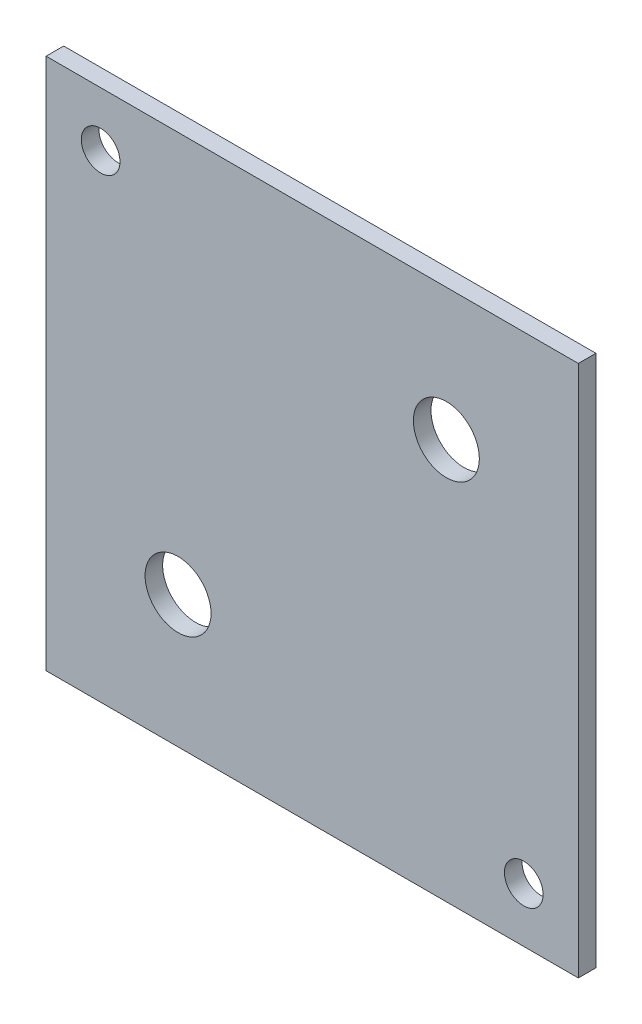
ISO-10303-21;
HEADER;
FILE_DESCRIPTION(('STEP AP214'),'2;1');
FILE_NAME('part.step','',(''),(''),'','','');
FILE_SCHEMA(('AUTOMOTIVE_DESIGN { 1 0 10303 214 1 1 1 1 }'));
ENDSEC;
DATA;
#1=APPLICATION_CONTEXT('core data for automotive mechanical design processes');
#2=APPLICATION_PROTOCOL_DEFINITION('international standard','automotive_design',2000,#1);
#3=PRODUCT_CONTEXT('',#1,'mechanical');
#4=PRODUCT('Part','Part','',(#3));
#5=PRODUCT_RELATED_PRODUCT_CATEGORY('part','',(#4));
#6=PRODUCT_DEFINITION_FORMATION('','',#4);
#7=PRODUCT_DEFINITION_CONTEXT('part definition',#1,'design');
#8=PRODUCT_DEFINITION('design','',#6,#7);
#9=PRODUCT_DEFINITION_SHAPE('','',#8);
#10=(LENGTH_UNIT() NAMED_UNIT(*) SI_UNIT(.MILLI.,.METRE.));
#11=(NAMED_UNIT(*) PLANE_ANGLE_UNIT() SI_UNIT($,.RADIAN.));
#12=(NAMED_UNIT(*) SI_UNIT($,.STERADIAN.) SOLID_ANGLE_UNIT());
#13=UNCERTAINTY_MEASURE_WITH_UNIT(LENGTH_MEASURE(1.E-05),#10,'distance_accuracy_value','');
#14=(GEOMETRIC_REPRESENTATION_CONTEXT(3) GLOBAL_UNCERTAINTY_ASSIGNED_CONTEXT((#13)) GLOBAL_UNIT_ASSIGNED_CONTEXT((#10,
#11,#12)) REPRESENTATION_CONTEXT('',''));
#15=CARTESIAN_POINT('',(0.,0.,0.));
#16=DIRECTION('',(0.,0.,1.));
#17=DIRECTION('',(1.,0.,0.));
#18=AXIS2_PLACEMENT_3D('',#15,#16,#17);
#19=CARTESIAN_POINT('',(0.,0.,1.));
#20=DIRECTION('',(0.,0.,1.));
#21=DIRECTION('',(1.,0.,0.));
#22=AXIS2_PLACEMENT_3D('',#19,#20,#21);
#23=PLANE('',#22);
#24=CARTESIAN_POINT('',(12.025,-12.025,1.));
#25=DIRECTION('',(0.,0.,1.));
#26=DIRECTION('',(1.,0.,0.));
#27=AXIS2_PLACEMENT_3D('',#24,#25,#26);
#28=CIRCLE('',#27,1.1);
#29=CARTESIAN_POINT('',(13.125,-12.025,1.));
#30=VERTEX_POINT('',#29);
#31=EDGE_CURVE('E129',#30,#30,#28,.F.);
#32=ORIENTED_EDGE('',*,*,#31,.T.);
#33=EDGE_LOOP('',(#32));
#34=FACE_BOUND('',#33,.T.);
#35=CARTESIAN_POINT('',(-12.025,12.025,1.));
#36=DIRECTION('',(0.,0.,1.));
#37=DIRECTION('',(1.,0.,0.));
#38=AXIS2_PLACEMENT_3D('',#35,#36,#37);
#39=CIRCLE('',#38,1.1);
#40=CARTESIAN_POINT('',(-10.925,12.025,1.));
#41=VERTEX_POINT('',#40);
#42=EDGE_CURVE('E121',#41,#41,#39,.F.);
#43=ORIENTED_EDGE('',*,*,#42,.T.);
#44=EDGE_LOOP('',(#43));
#45=FACE_BOUND('',#44,.T.);
#46=CARTESIAN_POINT('',(-7.62500000000001,-7.625,1.));
#47=DIRECTION('',(0.,0.,1.));
#48=DIRECTION('',(1.,0.,0.));
#49=AXIS2_PLACEMENT_3D('',#46,#47,#48);
#50=CIRCLE('',#49,1.875);
#51=CARTESIAN_POINT('',(-5.75000000000001,-7.625,1.));
#52=VERTEX_POINT('',#51);
#53=EDGE_CURVE('E100',#52,#52,#50,.T.);
#54=ORIENTED_EDGE('',*,*,#53,.F.);
#55=EDGE_LOOP('',(#54));
#56=FACE_BOUND('',#55,.T.);
#57=DIRECTION('',(0.,1.,0.));
#58=VECTOR('',#57,1.);
#59=CARTESIAN_POINT('',(15.125,15.125,1.));
#60=LINE('',#59,#58);
#61=CARTESIAN_POINT('',(15.125,-15.125,1.));
#62=VERTEX_POINT('',#61);
#63=CARTESIAN_POINT('',(15.125,15.125,1.));
#64=VERTEX_POINT('',#63);
#65=EDGE_CURVE('E85',#62,#64,#60,.T.);
#66=ORIENTED_EDGE('',*,*,#65,.T.);
#67=DIRECTION('',(-1.,0.,0.));
#68=VECTOR('',#67,1.);
#69=CARTESIAN_POINT('',(15.125,15.125,1.));
#70=LINE('',#69,#68);
#71=CARTESIAN_POINT('',(-15.125,15.125,1.));
#72=VERTEX_POINT('',#71);
#73=EDGE_CURVE('E80',#64,#72,#70,.T.);
#74=ORIENTED_EDGE('',*,*,#73,.T.);
#75=DIRECTION('',(0.,-1.,0.));
#76=VECTOR('',#75,1.);
#77=CARTESIAN_POINT('',(-15.125,-15.125,1.));
#78=LINE('',#77,#76);
#79=CARTESIAN_POINT('',(-15.125,-15.125,1.));
#80=VERTEX_POINT('',#79);
#81=EDGE_CURVE('E83',#72,#80,#78,.T.);
#82=ORIENTED_EDGE('',*,*,#81,.T.);
#83=DIRECTION('',(1.,0.,0.));
#84=VECTOR('',#83,1.);
#85=CARTESIAN_POINT('',(-15.125,-15.125,1.));
#86=LINE('',#85,#84);
#87=EDGE_CURVE('E50',#80,#62,#86,.T.);
#88=ORIENTED_EDGE('',*,*,#87,.T.);
#89=EDGE_LOOP('',(#66,#74,#82,#88));
#90=FACE_BOUND('',#89,.T.);
#91=CARTESIAN_POINT('',(7.62499999999999,7.62500000000001,1.));
#92=DIRECTION('',(0.,0.,1.));
#93=DIRECTION('',(1.,0.,0.));
#94=AXIS2_PLACEMENT_3D('',#91,#92,#93);
#95=CIRCLE('',#94,1.875);
#96=CARTESIAN_POINT('',(9.49999999999999,7.62500000000001,1.));
#97=VERTEX_POINT('',#96);
#98=EDGE_CURVE('E115',#97,#97,#95,.T.);
#99=ORIENTED_EDGE('',*,*,#98,.F.);
#100=EDGE_LOOP('',(#99));
#101=FACE_BOUND('',#100,.T.);
#102=ADVANCED_FACE('F33',(#34,#45,#56,#90,#101),#23,.T.);
#103=CARTESIAN_POINT('',(0.,0.,0.));
#104=DIRECTION('',(0.,0.,1.));
#105=DIRECTION('',(1.,0.,0.));
#106=AXIS2_PLACEMENT_3D('',#103,#104,#105);
#107=PLANE('',#106);
#108=CARTESIAN_POINT('',(12.025,-12.025,0.));
#109=DIRECTION('',(0.,0.,-1.));
#110=DIRECTION('',(-1.,0.,0.));
#111=AXIS2_PLACEMENT_3D('',#108,#109,#110);
#112=CIRCLE('',#111,1.1);
#113=CARTESIAN_POINT('',(10.925,-12.025,0.));
#114=VERTEX_POINT('',#113);
#115=EDGE_CURVE('E132',#114,#114,#112,.T.);
#116=ORIENTED_EDGE('',*,*,#115,.F.);
#117=EDGE_LOOP('',(#116));
#118=FACE_BOUND('',#117,.T.);
#119=CARTESIAN_POINT('',(-12.025,12.025,0.));
#120=DIRECTION('',(0.,0.,-1.));
#121=DIRECTION('',(-1.,0.,0.));
#122=AXIS2_PLACEMENT_3D('',#119,#120,#121);
#123=CIRCLE('',#122,1.1);
#124=CARTESIAN_POINT('',(-13.125,12.025,0.));
#125=VERTEX_POINT('',#124);
#126=EDGE_CURVE('E126',#125,#125,#123,.T.);
#127=ORIENTED_EDGE('',*,*,#126,.F.);
#128=EDGE_LOOP('',(#127));
#129=FACE_BOUND('',#128,.T.);
#130=CARTESIAN_POINT('',(-7.62500000000001,-7.625,0.));
#131=DIRECTION('',(0.,0.,1.));
#132=DIRECTION('',(1.,0.,0.));
#133=AXIS2_PLACEMENT_3D('',#130,#131,#132);
#134=CIRCLE('',#133,1.875);
#135=CARTESIAN_POINT('',(-5.75000000000001,-7.625,0.));
#136=VERTEX_POINT('',#135);
#137=EDGE_CURVE('E112',#136,#136,#134,.T.);
#138=ORIENTED_EDGE('',*,*,#137,.T.);
#139=EDGE_LOOP('',(#138));
#140=FACE_BOUND('',#139,.T.);
#141=DIRECTION('',(0.,1.,0.));
#142=VECTOR('',#141,1.);
#143=CARTESIAN_POINT('',(15.125,15.125,0.));
#144=LINE('',#143,#142);
#145=CARTESIAN_POINT('',(15.125,-15.125,0.));
#146=VERTEX_POINT('',#145);
#147=CARTESIAN_POINT('',(15.125,15.125,0.));
#148=VERTEX_POINT('',#147);
#149=EDGE_CURVE('E97',#146,#148,#144,.T.);
#150=ORIENTED_EDGE('',*,*,#149,.F.);
#151=DIRECTION('',(1.,0.,0.));
#152=VECTOR('',#151,1.);
#153=CARTESIAN_POINT('',(-15.125,-15.125,0.));
#154=LINE('',#153,#152);
#155=CARTESIAN_POINT('',(-15.125,-15.125,0.));
#156=VERTEX_POINT('',#155);
#157=EDGE_CURVE('E73',#156,#146,#154,.T.);
#158=ORIENTED_EDGE('',*,*,#157,.F.);
#159=DIRECTION('',(0.,-1.,0.));
#160=VECTOR('',#159,1.);
#161=CARTESIAN_POINT('',(-15.125,-15.125,0.));
#162=LINE('',#161,#160);
#163=CARTESIAN_POINT('',(-15.125,15.125,0.));
#164=VERTEX_POINT('',#163);
#165=EDGE_CURVE('E67',#164,#156,#162,.T.);
#166=ORIENTED_EDGE('',*,*,#165,.F.);
#167=DIRECTION('',(-1.,0.,0.));
#168=VECTOR('',#167,1.);
#169=CARTESIAN_POINT('',(15.125,15.125,0.));
#170=LINE('',#169,#168);
#171=EDGE_CURVE('E89',#148,#164,#170,.T.);
#172=ORIENTED_EDGE('',*,*,#171,.F.);
#173=EDGE_LOOP('',(#150,#158,#166,#172));
#174=FACE_BOUND('',#173,.T.);
#175=CARTESIAN_POINT('',(7.62499999999999,7.62500000000001,0.));
#176=DIRECTION('',(0.,0.,1.));
#177=DIRECTION('',(1.,0.,0.));
#178=AXIS2_PLACEMENT_3D('',#175,#176,#177);
#179=CIRCLE('',#178,1.875);
#180=CARTESIAN_POINT('',(9.49999999999999,7.62500000000001,0.));
#181=VERTEX_POINT('',#180);
#182=EDGE_CURVE('E118',#181,#181,#179,.T.);
#183=ORIENTED_EDGE('',*,*,#182,.T.);
#184=EDGE_LOOP('',(#183));
#185=FACE_BOUND('',#184,.T.);
#186=ADVANCED_FACE('F108',(#118,#129,#140,#174,#185),#107,.F.);
#187=CARTESIAN_POINT('',(15.125,15.125,1.));
#188=DIRECTION('',(-1.,0.,0.));
#189=DIRECTION('',(0.,-1.,0.));
#190=AXIS2_PLACEMENT_3D('',#187,#188,#189);
#191=PLANE('',#190);
#192=ORIENTED_EDGE('',*,*,#149,.T.);
#193=DIRECTION('',(0.,0.,-1.));
#194=VECTOR('',#193,1.);
#195=CARTESIAN_POINT('',(15.125,15.125,1.));
#196=LINE('',#195,#194);
#197=EDGE_CURVE('E11',#64,#148,#196,.T.);
#198=ORIENTED_EDGE('',*,*,#197,.F.);
#199=ORIENTED_EDGE('',*,*,#65,.F.);
#200=DIRECTION('',(0.,0.,-1.));
#201=VECTOR('',#200,1.);
#202=CARTESIAN_POINT('',(15.125,-15.125,1.));
#203=LINE('',#202,#201);
#204=EDGE_CURVE('E93',#62,#146,#203,.T.);
#205=ORIENTED_EDGE('',*,*,#204,.T.);
#206=EDGE_LOOP('',(#192,#198,#199,#205));
#207=FACE_BOUND('',#206,.T.);
#208=ADVANCED_FACE('F35',(#207),#191,.F.);
#209=CARTESIAN_POINT('',(15.125,15.125,1.));
#210=DIRECTION('',(0.,-1.,0.));
#211=DIRECTION('',(1.,0.,0.));
#212=AXIS2_PLACEMENT_3D('',#209,#210,#211);
#213=PLANE('',#212);
#214=ORIENTED_EDGE('',*,*,#171,.T.);
#215=DIRECTION('',(0.,0.,-1.));
#216=VECTOR('',#215,1.);
#217=CARTESIAN_POINT('',(-15.125,15.125,1.));
#218=LINE('',#217,#216);
#219=EDGE_CURVE('E42',#72,#164,#218,.T.);
#220=ORIENTED_EDGE('',*,*,#219,.F.);
#221=ORIENTED_EDGE('',*,*,#73,.F.);
#222=ORIENTED_EDGE('',*,*,#197,.T.);
#223=EDGE_LOOP('',(#214,#220,#221,#222));
#224=FACE_BOUND('',#223,.T.);
#225=ADVANCED_FACE('F88',(#224),#213,.F.);
#226=CARTESIAN_POINT('',(-15.125,-15.125,1.));
#227=DIRECTION('',(1.,0.,0.));
#228=DIRECTION('',(0.,1.,0.));
#229=AXIS2_PLACEMENT_3D('',#226,#227,#228);
#230=PLANE('',#229);
#231=ORIENTED_EDGE('',*,*,#165,.T.);
#232=DIRECTION('',(0.,0.,-1.));
#233=VECTOR('',#232,1.);
#234=CARTESIAN_POINT('',(-15.125,-15.125,1.));
#235=LINE('',#234,#233);
#236=EDGE_CURVE('E90',#80,#156,#235,.T.);
#237=ORIENTED_EDGE('',*,*,#236,.F.);
#238=ORIENTED_EDGE('',*,*,#81,.F.);
#239=ORIENTED_EDGE('',*,*,#219,.T.);
#240=EDGE_LOOP('',(#231,#237,#238,#239));
#241=FACE_BOUND('',#240,.T.);
#242=ADVANCED_FACE('F91',(#241),#230,.F.);
#243=CARTESIAN_POINT('',(-15.125,-15.125,1.));
#244=DIRECTION('',(0.,1.,0.));
#245=DIRECTION('',(-1.,0.,0.));
#246=AXIS2_PLACEMENT_3D('',#243,#244,#245);
#247=PLANE('',#246);
#248=ORIENTED_EDGE('',*,*,#157,.T.);
#249=ORIENTED_EDGE('',*,*,#204,.F.);
#250=ORIENTED_EDGE('',*,*,#87,.F.);
#251=ORIENTED_EDGE('',*,*,#236,.T.);
#252=EDGE_LOOP('',(#248,#249,#250,#251));
#253=FACE_BOUND('',#252,.T.);
#254=ADVANCED_FACE('F105',(#253),#247,.F.);
#255=CARTESIAN_POINT('',(-7.62500000000001,-7.625,1.));
#256=DIRECTION('',(0.,0.,-1.));
#257=DIRECTION('',(-1.,0.,0.));
#258=AXIS2_PLACEMENT_3D('',#255,#256,#257);
#259=CYLINDRICAL_SURFACE('',#258,1.875);
#260=ORIENTED_EDGE('',*,*,#53,.T.);
#261=EDGE_LOOP('',(#260));
#262=FACE_BOUND('',#261,.T.);
#263=ORIENTED_EDGE('',*,*,#137,.F.);
#264=EDGE_LOOP('',(#263));
#265=FACE_BOUND('',#264,.T.);
#266=ADVANCED_FACE('F146',(#262,#265),#259,.F.);
#267=CARTESIAN_POINT('',(7.62499999999999,7.62500000000001,1.));
#268=DIRECTION('',(0.,0.,-1.));
#269=DIRECTION('',(-1.,0.,0.));
#270=AXIS2_PLACEMENT_3D('',#267,#268,#269);
#271=CYLINDRICAL_SURFACE('',#270,1.875);
#272=ORIENTED_EDGE('',*,*,#98,.T.);
#273=EDGE_LOOP('',(#272));
#274=FACE_BOUND('',#273,.T.);
#275=ORIENTED_EDGE('',*,*,#182,.F.);
#276=EDGE_LOOP('',(#275));
#277=FACE_BOUND('',#276,.T.);
#278=ADVANCED_FACE('F148',(#274,#277),#271,.F.);
#279=CARTESIAN_POINT('',(-12.025,12.025,4.11126983722081));
#280=DIRECTION('',(0.,0.,-1.));
#281=DIRECTION('',(-1.,0.,0.));
#282=AXIS2_PLACEMENT_3D('',#279,#280,#281);
#283=CYLINDRICAL_SURFACE('',#282,1.1);
#284=ORIENTED_EDGE('',*,*,#126,.T.);
#285=EDGE_LOOP('',(#284));
#286=FACE_BOUND('',#285,.T.);
#287=ORIENTED_EDGE('',*,*,#42,.F.);
#288=EDGE_LOOP('',(#287));
#289=FACE_BOUND('',#288,.T.);
#290=ADVANCED_FACE('F155',(#286,#289),#283,.F.);
#291=CARTESIAN_POINT('',(12.025,-12.025,4.11126983722081));
#292=DIRECTION('',(0.,0.,-1.));
#293=DIRECTION('',(-1.,0.,0.));
#294=AXIS2_PLACEMENT_3D('',#291,#292,#293);
#295=CYLINDRICAL_SURFACE('',#294,1.1);
#296=ORIENTED_EDGE('',*,*,#115,.T.);
#297=EDGE_LOOP('',(#296));
#298=FACE_BOUND('',#297,.T.);
#299=ORIENTED_EDGE('',*,*,#31,.F.);
#300=EDGE_LOOP('',(#299));
#301=FACE_BOUND('',#300,.T.);
#302=ADVANCED_FACE('F136',(#298,#301),#295,.F.);
#303=CLOSED_SHELL('',(#102,#186,#208,#225,#242,#254,#266,#278,#290,#302));
#304=MANIFOLD_SOLID_BREP('B2',#303);
#305=ADVANCED_BREP_SHAPE_REPRESENTATION('',(#18,#304),#14);
#306=SHAPE_DEFINITION_REPRESENTATION(#9,#305);
ENDSEC;
END-ISO-10303-21;
